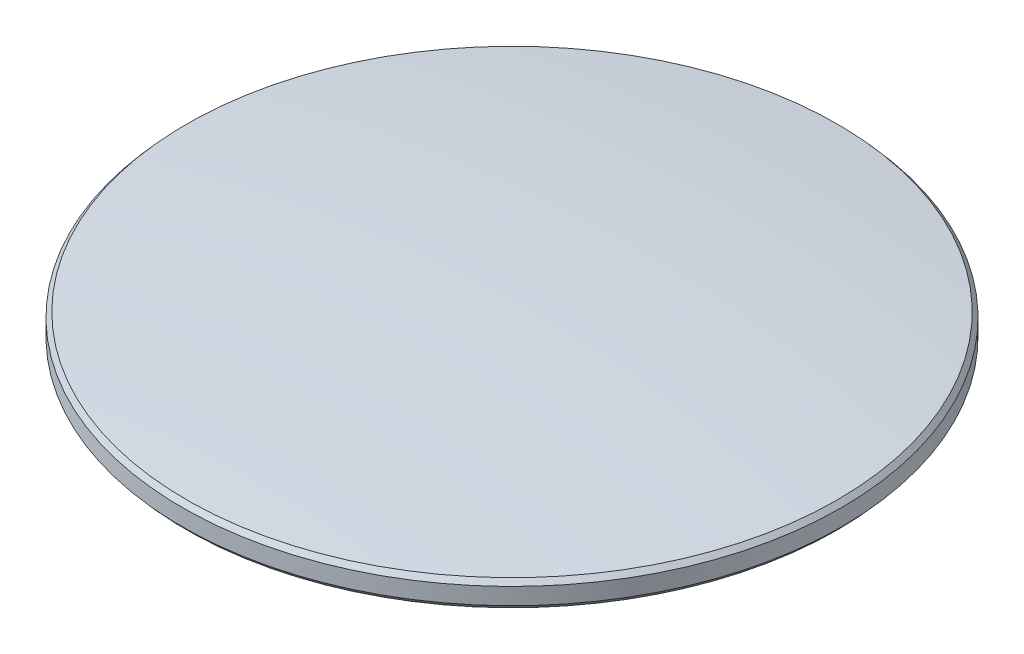
ISO-10303-21;
HEADER;
FILE_DESCRIPTION(('STEP AP214'),'2;1');
FILE_NAME('part.step','',(''),(''),'','','');
FILE_SCHEMA(('AUTOMOTIVE_DESIGN { 1 0 10303 214 1 1 1 1 }'));
ENDSEC;
DATA;
#1=APPLICATION_CONTEXT('core data for automotive mechanical design processes');
#2=APPLICATION_PROTOCOL_DEFINITION('international standard','automotive_design',2000,#1);
#3=PRODUCT_CONTEXT('',#1,'mechanical');
#4=PRODUCT('Part','Part','',(#3));
#5=PRODUCT_RELATED_PRODUCT_CATEGORY('part','',(#4));
#6=PRODUCT_DEFINITION_FORMATION('','',#4);
#7=PRODUCT_DEFINITION_CONTEXT('part definition',#1,'design');
#8=PRODUCT_DEFINITION('design','',#6,#7);
#9=PRODUCT_DEFINITION_SHAPE('','',#8);
#10=(LENGTH_UNIT() NAMED_UNIT(*) SI_UNIT(.MILLI.,.METRE.));
#11=(NAMED_UNIT(*) PLANE_ANGLE_UNIT() SI_UNIT($,.RADIAN.));
#12=(NAMED_UNIT(*) SI_UNIT($,.STERADIAN.) SOLID_ANGLE_UNIT());
#13=UNCERTAINTY_MEASURE_WITH_UNIT(LENGTH_MEASURE(1.E-05),#10,'distance_accuracy_value','');
#14=(GEOMETRIC_REPRESENTATION_CONTEXT(3) GLOBAL_UNCERTAINTY_ASSIGNED_CONTEXT((#13)) GLOBAL_UNIT_ASSIGNED_CONTEXT((#10,
#11,#12)) REPRESENTATION_CONTEXT('',''));
#15=CARTESIAN_POINT('',(0.,0.,0.));
#16=DIRECTION('',(0.,0.,1.));
#17=DIRECTION('',(1.,0.,0.));
#18=AXIS2_PLACEMENT_3D('',#15,#16,#17);
#19=CARTESIAN_POINT('',(0.,-309.3,0.));
#20=DIRECTION('',(0.,-1.,0.));
#21=DIRECTION('',(1.,0.,0.));
#22=AXIS2_PLACEMENT_3D('',#19,#20,#21);
#23=SPHERICAL_SURFACE('',#22,313.3);
#24=CARTESIAN_POINT('',(0.,1.5625865448004,0.));
#25=DIRECTION('',(0.,-1.,0.));
#26=DIRECTION('',(1.,0.,0.));
#27=AXIS2_PLACEMENT_3D('',#24,#25,#26);
#28=CIRCLE('',#27,39.0043880438663);
#29=CARTESIAN_POINT('',(39.0043880438663,1.5625865448004,0.));
#30=VERTEX_POINT('',#29);
#31=EDGE_CURVE('E42',#30,#30,#28,.F.);
#32=ORIENTED_EDGE('',*,*,#31,.T.);
#33=EDGE_LOOP('',(#32));
#34=FACE_BOUND('',#33,.T.);
#35=ADVANCED_FACE('F31',(#34),#23,.T.);
#36=CARTESIAN_POINT('',(0.,0.,0.));
#37=DIRECTION('',(0.,-1.,0.));
#38=DIRECTION('',(1.,0.,0.));
#39=AXIS2_PLACEMENT_3D('',#36,#37,#38);
#40=CYLINDRICAL_SURFACE('',#39,39.5);
#41=CARTESIAN_POINT('',(0.,-1.,0.));
#42=DIRECTION('',(0.,1.,0.));
#43=DIRECTION('',(-1.,0.,0.));
#44=AXIS2_PLACEMENT_3D('',#41,#42,#43);
#45=CIRCLE('',#44,39.5);
#46=CARTESIAN_POINT('',(-39.5,-1.,0.));
#47=VERTEX_POINT('',#46);
#48=EDGE_CURVE('E10',#47,#47,#45,.T.);
#49=ORIENTED_EDGE('',*,*,#48,.T.);
#50=EDGE_LOOP('',(#49));
#51=FACE_BOUND('',#50,.T.);
#52=CARTESIAN_POINT('',(0.,1.00000000000006,0.));
#53=DIRECTION('',(0.,-1.,0.));
#54=DIRECTION('',(1.,0.,0.));
#55=AXIS2_PLACEMENT_3D('',#52,#53,#54);
#56=CIRCLE('',#55,39.5);
#57=CARTESIAN_POINT('',(39.5,1.00000000000006,0.));
#58=VERTEX_POINT('',#57);
#59=EDGE_CURVE('E46',#58,#58,#56,.T.);
#60=ORIENTED_EDGE('',*,*,#59,.T.);
#61=EDGE_LOOP('',(#60));
#62=FACE_BOUND('',#61,.T.);
#63=ADVANCED_FACE('F52',(#51,#62),#40,.T.);
#64=CARTESIAN_POINT('',(0.,1.00000000000006,0.));
#65=DIRECTION('',(0.,-1.,0.));
#66=DIRECTION('',(1.,0.,0.));
#67=AXIS2_PLACEMENT_3D('',#64,#65,#66);
#68=CONICAL_SURFACE('',#67,39.5,0.722191331500028);
#69=ORIENTED_EDGE('',*,*,#31,.F.);
#70=EDGE_LOOP('',(#69));
#71=FACE_BOUND('',#70,.T.);
#72=ORIENTED_EDGE('',*,*,#59,.F.);
#73=EDGE_LOOP('',(#72));
#74=FACE_BOUND('',#73,.T.);
#75=ADVANCED_FACE('F54',(#71,#74),#68,.T.);
#76=CARTESIAN_POINT('',(0.,309.3,0.));
#77=DIRECTION('',(0.,1.,0.));
#78=DIRECTION('',(1.,0.,0.));
#79=AXIS2_PLACEMENT_3D('',#76,#77,#78);
#80=SPHERICAL_SURFACE('',#79,313.3);
#81=CARTESIAN_POINT('',(0.,-1.5625865448004,0.));
#82=DIRECTION('',(0.,1.,0.));
#83=DIRECTION('',(-1.,0.,0.));
#84=AXIS2_PLACEMENT_3D('',#81,#82,#83);
#85=CIRCLE('',#84,39.0043880438663);
#86=CARTESIAN_POINT('',(-39.0043880438663,-1.5625865448004,0.));
#87=VERTEX_POINT('',#86);
#88=EDGE_CURVE('E38',#87,#87,#85,.F.);
#89=ORIENTED_EDGE('',*,*,#88,.T.);
#90=EDGE_LOOP('',(#89));
#91=FACE_BOUND('',#90,.T.);
#92=ADVANCED_FACE('F56',(#91),#80,.T.);
#93=CARTESIAN_POINT('',(0.,-1.56258654480035,0.));
#94=DIRECTION('',(0.,1.,0.));
#95=DIRECTION('',(-1.,0.,0.));
#96=AXIS2_PLACEMENT_3D('',#93,#94,#95);
#97=CONICAL_SURFACE('',#96,39.0043880438663,0.722191331500014);
#98=ORIENTED_EDGE('',*,*,#48,.F.);
#99=EDGE_LOOP('',(#98));
#100=FACE_BOUND('',#99,.T.);
#101=ORIENTED_EDGE('',*,*,#88,.F.);
#102=EDGE_LOOP('',(#101));
#103=FACE_BOUND('',#102,.T.);
#104=ADVANCED_FACE('F33',(#100,#103),#97,.T.);
#105=CLOSED_SHELL('',(#35,#63,#75,#92,#104));
#106=MANIFOLD_SOLID_BREP('B2',#105);
#107=ADVANCED_BREP_SHAPE_REPRESENTATION('',(#18,#106),#14);
#108=SHAPE_DEFINITION_REPRESENTATION(#9,#107);
ENDSEC;
END-ISO-10303-21;
